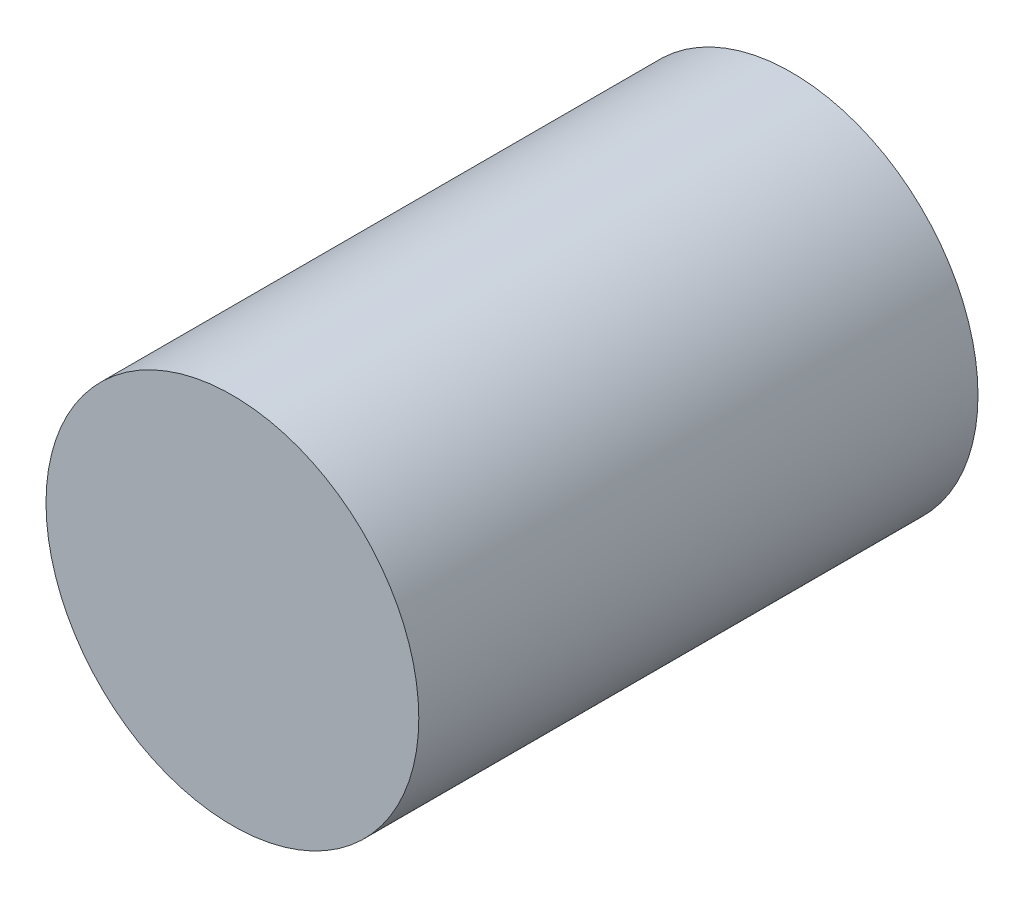
ISO-10303-21;
HEADER;
FILE_DESCRIPTION(('STEP AP214'),'2;1');
FILE_NAME('part.step','',(''),(''),'','','');
FILE_SCHEMA(('AUTOMOTIVE_DESIGN { 1 0 10303 214 1 1 1 1 }'));
ENDSEC;
DATA;
#1=APPLICATION_CONTEXT('core data for automotive mechanical design processes');
#2=APPLICATION_PROTOCOL_DEFINITION('international standard','automotive_design',2000,#1);
#3=PRODUCT_CONTEXT('',#1,'mechanical');
#4=PRODUCT('Part','Part','',(#3));
#5=PRODUCT_RELATED_PRODUCT_CATEGORY('part','',(#4));
#6=PRODUCT_DEFINITION_FORMATION('','',#4);
#7=PRODUCT_DEFINITION_CONTEXT('part definition',#1,'design');
#8=PRODUCT_DEFINITION('design','',#6,#7);
#9=PRODUCT_DEFINITION_SHAPE('','',#8);
#10=(LENGTH_UNIT() NAMED_UNIT(*) SI_UNIT(.MILLI.,.METRE.));
#11=(NAMED_UNIT(*) PLANE_ANGLE_UNIT() SI_UNIT($,.RADIAN.));
#12=(NAMED_UNIT(*) SI_UNIT($,.STERADIAN.) SOLID_ANGLE_UNIT());
#13=UNCERTAINTY_MEASURE_WITH_UNIT(LENGTH_MEASURE(1.E-05),#10,'distance_accuracy_value','');
#14=(GEOMETRIC_REPRESENTATION_CONTEXT(3) GLOBAL_UNCERTAINTY_ASSIGNED_CONTEXT((#13)) GLOBAL_UNIT_ASSIGNED_CONTEXT((#10,
#11,#12)) REPRESENTATION_CONTEXT('',''));
#15=CARTESIAN_POINT('',(0.,0.,0.));
#16=DIRECTION('',(0.,0.,1.));
#17=DIRECTION('',(1.,0.,0.));
#18=AXIS2_PLACEMENT_3D('',#15,#16,#17);
#19=CARTESIAN_POINT('',(0.,0.,150.));
#20=DIRECTION('',(0.,0.,-1.));
#21=DIRECTION('',(-1.,0.,0.));
#22=AXIS2_PLACEMENT_3D('',#19,#20,#21);
#23=CYLINDRICAL_SURFACE('',#22,50.);
#24=CARTESIAN_POINT('',(0.,0.,150.));
#25=DIRECTION('',(0.,0.,1.));
#26=DIRECTION('',(1.,0.,0.));
#27=AXIS2_PLACEMENT_3D('',#24,#25,#26);
#28=CIRCLE('',#27,50.);
#29=CARTESIAN_POINT('',(50.,0.,150.));
#30=VERTEX_POINT('',#29);
#31=EDGE_CURVE('E10',#30,#30,#28,.T.);
#32=ORIENTED_EDGE('',*,*,#31,.F.);
#33=EDGE_LOOP('',(#32));
#34=FACE_BOUND('',#33,.T.);
#35=CARTESIAN_POINT('',(0.,0.,0.));
#36=DIRECTION('',(0.,0.,1.));
#37=DIRECTION('',(1.,0.,0.));
#38=AXIS2_PLACEMENT_3D('',#35,#36,#37);
#39=CIRCLE('',#38,50.);
#40=CARTESIAN_POINT('',(50.,0.,0.));
#41=VERTEX_POINT('',#40);
#42=EDGE_CURVE('E38',#41,#41,#39,.T.);
#43=ORIENTED_EDGE('',*,*,#42,.T.);
#44=EDGE_LOOP('',(#43));
#45=FACE_BOUND('',#44,.T.);
#46=ADVANCED_FACE('F35',(#34,#45),#23,.T.);
#47=CARTESIAN_POINT('',(0.,0.,150.));
#48=DIRECTION('',(0.,0.,1.));
#49=DIRECTION('',(1.,0.,0.));
#50=AXIS2_PLACEMENT_3D('',#47,#48,#49);
#51=PLANE('',#50);
#52=ORIENTED_EDGE('',*,*,#31,.T.);
#53=EDGE_LOOP('',(#52));
#54=FACE_BOUND('',#53,.T.);
#55=ADVANCED_FACE('F50',(#54),#51,.T.);
#56=CARTESIAN_POINT('',(0.,0.,0.));
#57=DIRECTION('',(0.,0.,1.));
#58=DIRECTION('',(1.,0.,0.));
#59=AXIS2_PLACEMENT_3D('',#56,#57,#58);
#60=PLANE('',#59);
#61=ORIENTED_EDGE('',*,*,#42,.F.);
#62=EDGE_LOOP('',(#61));
#63=FACE_BOUND('',#62,.T.);
#64=ADVANCED_FACE('F48',(#63),#60,.F.);
#65=CLOSED_SHELL('',(#46,#55,#64));
#66=MANIFOLD_SOLID_BREP('B2',#65);
#67=ADVANCED_BREP_SHAPE_REPRESENTATION('',(#18,#66),#14);
#68=SHAPE_DEFINITION_REPRESENTATION(#9,#67);
ENDSEC;
END-ISO-10303-21;
